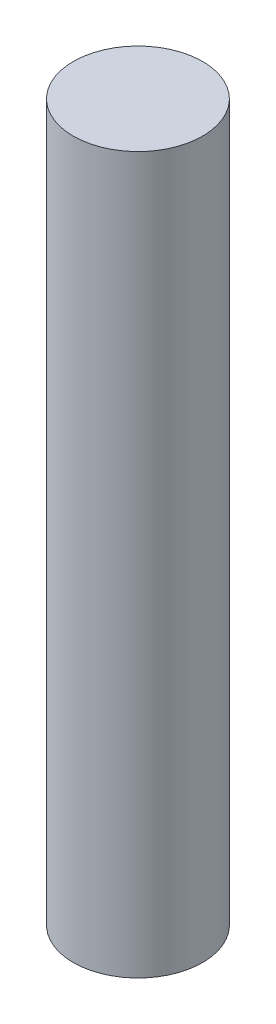
ISO-10303-21;
HEADER;
FILE_DESCRIPTION(('STEP AP214'),'2;1');
FILE_NAME('part.step','',(''),(''),'','','');
FILE_SCHEMA(('AUTOMOTIVE_DESIGN { 1 0 10303 214 1 1 1 1 }'));
ENDSEC;
DATA;
#1=APPLICATION_CONTEXT('core data for automotive mechanical design processes');
#2=APPLICATION_PROTOCOL_DEFINITION('international standard','automotive_design',2000,#1);
#3=PRODUCT_CONTEXT('',#1,'mechanical');
#4=PRODUCT('Part','Part','',(#3));
#5=PRODUCT_RELATED_PRODUCT_CATEGORY('part','',(#4));
#6=PRODUCT_DEFINITION_FORMATION('','',#4);
#7=PRODUCT_DEFINITION_CONTEXT('part definition',#1,'design');
#8=PRODUCT_DEFINITION('design','',#6,#7);
#9=PRODUCT_DEFINITION_SHAPE('','',#8);
#10=(LENGTH_UNIT() NAMED_UNIT(*) SI_UNIT(.MILLI.,.METRE.));
#11=(NAMED_UNIT(*) PLANE_ANGLE_UNIT() SI_UNIT($,.RADIAN.));
#12=(NAMED_UNIT(*) SI_UNIT($,.STERADIAN.) SOLID_ANGLE_UNIT());
#13=UNCERTAINTY_MEASURE_WITH_UNIT(LENGTH_MEASURE(1.E-05),#10,'distance_accuracy_value','');
#14=(GEOMETRIC_REPRESENTATION_CONTEXT(3) GLOBAL_UNCERTAINTY_ASSIGNED_CONTEXT((#13)) GLOBAL_UNIT_ASSIGNED_CONTEXT((#10,
#11,#12)) REPRESENTATION_CONTEXT('',''));
#15=CARTESIAN_POINT('',(0.,0.,0.));
#16=DIRECTION('',(0.,0.,1.));
#17=DIRECTION('',(1.,0.,0.));
#18=AXIS2_PLACEMENT_3D('',#15,#16,#17);
#19=CARTESIAN_POINT('',(0.,-275.,0.));
#20=DIRECTION('',(0.,1.,0.));
#21=DIRECTION('',(0.,0.,1.));
#22=AXIS2_PLACEMENT_3D('',#19,#20,#21);
#23=CYLINDRICAL_SURFACE('',#22,45.);
#24=CARTESIAN_POINT('',(0.,-275.,0.));
#25=DIRECTION('',(0.,1.,0.));
#26=DIRECTION('',(0.,0.,1.));
#27=AXIS2_PLACEMENT_3D('',#24,#25,#26);
#28=CIRCLE('',#27,45.);
#29=CARTESIAN_POINT('',(0.,-275.,45.));
#30=VERTEX_POINT('',#29);
#31=EDGE_CURVE('E10',#30,#30,#28,.T.);
#32=ORIENTED_EDGE('',*,*,#31,.T.);
#33=EDGE_LOOP('',(#32));
#34=FACE_BOUND('',#33,.T.);
#35=CARTESIAN_POINT('',(0.,223.,0.));
#36=DIRECTION('',(0.,1.,0.));
#37=DIRECTION('',(0.,0.,1.));
#38=AXIS2_PLACEMENT_3D('',#35,#36,#37);
#39=CIRCLE('',#38,45.);
#40=CARTESIAN_POINT('',(0.,223.,45.));
#41=VERTEX_POINT('',#40);
#42=EDGE_CURVE('E48',#41,#41,#39,.T.);
#43=ORIENTED_EDGE('',*,*,#42,.F.);
#44=EDGE_LOOP('',(#43));
#45=FACE_BOUND('',#44,.T.);
#46=ADVANCED_FACE('F41',(#34,#45),#23,.T.);
#47=CARTESIAN_POINT('',(0.,-275.,0.));
#48=DIRECTION('',(0.,1.,0.));
#49=DIRECTION('',(0.,0.,1.));
#50=AXIS2_PLACEMENT_3D('',#47,#48,#49);
#51=PLANE('',#50);
#52=ORIENTED_EDGE('',*,*,#31,.F.);
#53=EDGE_LOOP('',(#52));
#54=FACE_BOUND('',#53,.T.);
#55=ADVANCED_FACE('F58',(#54),#51,.F.);
#56=CARTESIAN_POINT('',(0.,223.,0.));
#57=DIRECTION('',(0.,1.,0.));
#58=DIRECTION('',(0.,0.,1.));
#59=AXIS2_PLACEMENT_3D('',#56,#57,#58);
#60=PLANE('',#59);
#61=ORIENTED_EDGE('',*,*,#42,.T.);
#62=EDGE_LOOP('',(#61));
#63=FACE_BOUND('',#62,.T.);
#64=ADVANCED_FACE('F55',(#63),#60,.T.);
#65=CLOSED_SHELL('',(#46,#55,#64));
#66=MANIFOLD_SOLID_BREP('B2',#65);
#67=ADVANCED_BREP_SHAPE_REPRESENTATION('',(#18,#66),#14);
#68=SHAPE_DEFINITION_REPRESENTATION(#9,#67);
ENDSEC;
END-ISO-10303-21;
